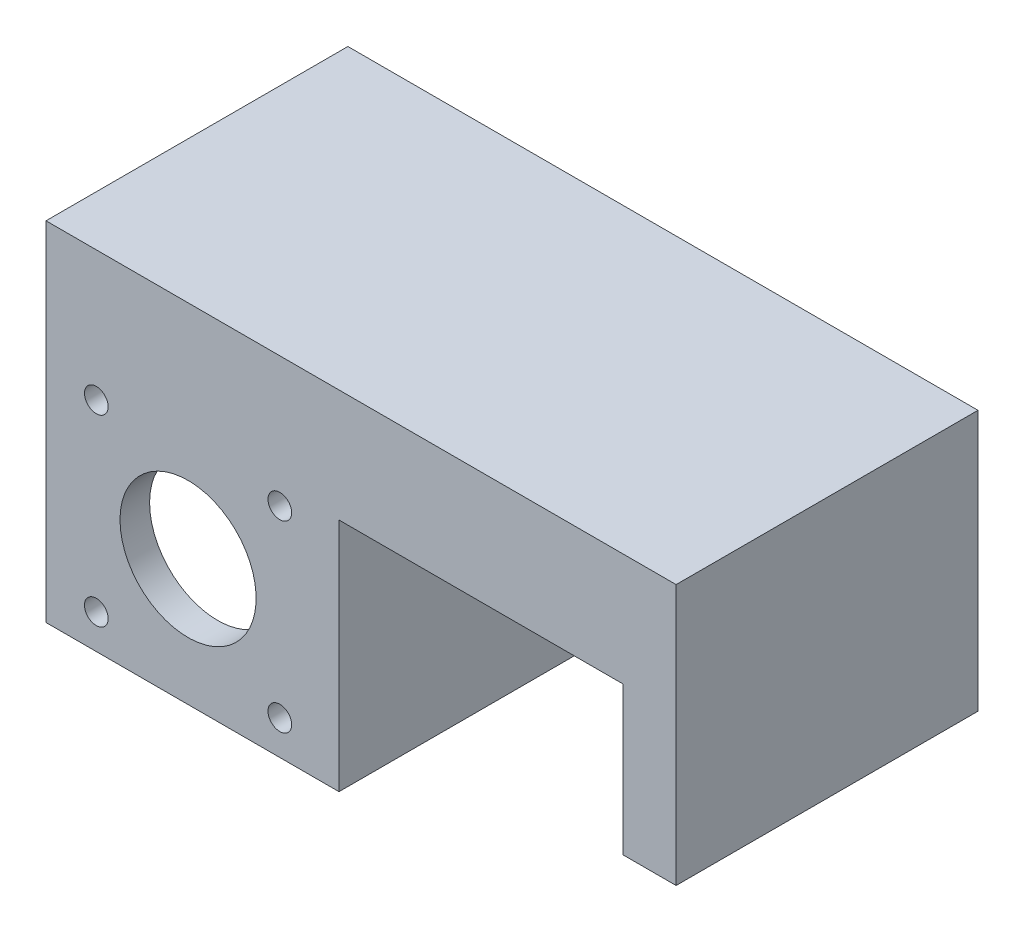
ISO-10303-21;
HEADER;
FILE_DESCRIPTION(('STEP AP214'),'2;1');
FILE_NAME('part.step','',(''),(''),'','','');
FILE_SCHEMA(('AUTOMOTIVE_DESIGN { 1 0 10303 214 1 1 1 1 }'));
ENDSEC;
DATA;
#1=APPLICATION_CONTEXT('core data for automotive mechanical design processes');
#2=APPLICATION_PROTOCOL_DEFINITION('international standard','automotive_design',2000,#1);
#3=PRODUCT_CONTEXT('',#1,'mechanical');
#4=PRODUCT('Part','Part','',(#3));
#5=PRODUCT_RELATED_PRODUCT_CATEGORY('part','',(#4));
#6=PRODUCT_DEFINITION_FORMATION('','',#4);
#7=PRODUCT_DEFINITION_CONTEXT('part definition',#1,'design');
#8=PRODUCT_DEFINITION('design','',#6,#7);
#9=PRODUCT_DEFINITION_SHAPE('','',#8);
#10=(LENGTH_UNIT() NAMED_UNIT(*) SI_UNIT(.MILLI.,.METRE.));
#11=(NAMED_UNIT(*) PLANE_ANGLE_UNIT() SI_UNIT($,.RADIAN.));
#12=(NAMED_UNIT(*) SI_UNIT($,.STERADIAN.) SOLID_ANGLE_UNIT());
#13=UNCERTAINTY_MEASURE_WITH_UNIT(LENGTH_MEASURE(1.E-05),#10,'distance_accuracy_value','');
#14=(GEOMETRIC_REPRESENTATION_CONTEXT(3) GLOBAL_UNCERTAINTY_ASSIGNED_CONTEXT((#13)) GLOBAL_UNIT_ASSIGNED_CONTEXT((#10,
#11,#12)) REPRESENTATION_CONTEXT('',''));
#15=CARTESIAN_POINT('',(0.,0.,0.));
#16=DIRECTION('',(0.,0.,1.));
#17=DIRECTION('',(1.,0.,0.));
#18=AXIS2_PLACEMENT_3D('',#15,#16,#17);
#19=CARTESIAN_POINT('',(49.5,-5.616325,-60.3469004731473));
#20=DIRECTION('',(-1.,0.,0.));
#21=DIRECTION('',(0.,-1.,0.));
#22=AXIS2_PLACEMENT_3D('',#19,#20,#21);
#23=PLANE('',#22);
#24=DIRECTION('',(0.,1.,0.));
#25=VECTOR('',#24,1.);
#26=CARTESIAN_POINT('',(49.5,-33.166325,-9.8082122));
#27=LINE('',#26,#25);
#28=CARTESIAN_POINT('',(49.5,-33.166325,-9.8082122));
#29=VERTEX_POINT('',#28);
#30=CARTESIAN_POINT('',(49.5,-8.166325,-9.8082122));
#31=VERTEX_POINT('',#30);
#32=EDGE_CURVE('E264',#29,#31,#27,.T.);
#33=ORIENTED_EDGE('',*,*,#32,.T.);
#34=DIRECTION('',(0.,0.,-1.));
#35=VECTOR('',#34,1.);
#36=CARTESIAN_POINT('',(49.5,-8.166325,-60.3469004731473));
#37=LINE('',#36,#35);
#38=CARTESIAN_POINT('',(49.5,-8.166325,33.1917878));
#39=VERTEX_POINT('',#38);
#40=EDGE_CURVE('E11',#39,#31,#37,.T.);
#41=ORIENTED_EDGE('',*,*,#40,.F.);
#42=DIRECTION('',(0.,-1.,0.));
#43=VECTOR('',#42,1.);
#44=CARTESIAN_POINT('',(49.5,-5.616325,33.1917878));
#45=LINE('',#44,#43);
#46=CARTESIAN_POINT('',(49.5,-47.916325,33.1917878));
#47=VERTEX_POINT('',#46);
#48=EDGE_CURVE('E250',#39,#47,#45,.T.);
#49=ORIENTED_EDGE('',*,*,#48,.T.);
#50=DIRECTION('',(0.,0.,1.));
#51=VECTOR('',#50,1.);
#52=CARTESIAN_POINT('',(49.5,-47.916325,-60.3469004731473));
#53=LINE('',#52,#51);
#54=CARTESIAN_POINT('',(49.5,-47.916325,-17.8082122));
#55=VERTEX_POINT('',#54);
#56=EDGE_CURVE('E146',#55,#47,#53,.T.);
#57=ORIENTED_EDGE('',*,*,#56,.F.);
#58=DIRECTION('',(0.,1.,0.));
#59=VECTOR('',#58,1.);
#60=CARTESIAN_POINT('',(49.5,-5.61632499999999,-17.8082122));
#61=LINE('',#60,#59);
#62=CARTESIAN_POINT('',(49.5,-33.166325,-17.8082122));
#63=VERTEX_POINT('',#62);
#64=EDGE_CURVE('E125',#55,#63,#61,.T.);
#65=ORIENTED_EDGE('',*,*,#64,.T.);
#66=DIRECTION('',(0.,0.,-1.));
#67=VECTOR('',#66,1.);
#68=CARTESIAN_POINT('',(49.5,-33.166325,-17.8082122));
#69=LINE('',#68,#67);
#70=EDGE_CURVE('E133',#29,#63,#69,.T.);
#71=ORIENTED_EDGE('',*,*,#70,.F.);
#72=EDGE_LOOP('',(#33,#41,#49,#57,#65,#71));
#73=FACE_BOUND('',#72,.T.);
#74=ADVANCED_FACE('F33',(#73),#23,.F.);
#75=CARTESIAN_POINT('',(0.,-8.166325,0.));
#76=DIRECTION('',(0.,1.,0.));
#77=DIRECTION('',(0.,0.,1.));
#78=AXIS2_PLACEMENT_3D('',#75,#76,#77);
#79=PLANE('',#78);
#80=DIRECTION('',(0.,0.,-1.));
#81=VECTOR('',#80,1.);
#82=CARTESIAN_POINT('',(97.45,-8.166325,-9.80821219999999));
#83=LINE('',#82,#81);
#84=CARTESIAN_POINT('',(97.45,-8.166325,33.1917878));
#85=VERTEX_POINT('',#84);
#86=CARTESIAN_POINT('',(97.45,-8.166325,-9.80821219999999));
#87=VERTEX_POINT('',#86);
#88=EDGE_CURVE('E262',#85,#87,#83,.T.);
#89=ORIENTED_EDGE('',*,*,#88,.F.);
#90=DIRECTION('',(-1.,0.,0.));
#91=VECTOR('',#90,1.);
#92=CARTESIAN_POINT('',(49.5,-8.166325,33.1917878));
#93=LINE('',#92,#91);
#94=EDGE_CURVE('E156',#85,#39,#93,.T.);
#95=ORIENTED_EDGE('',*,*,#94,.T.);
#96=ORIENTED_EDGE('',*,*,#40,.T.);
#97=DIRECTION('',(-1.,0.,0.));
#98=VECTOR('',#97,1.);
#99=CARTESIAN_POINT('',(49.5,-8.166325,-9.8082122));
#100=LINE('',#99,#98);
#101=EDGE_CURVE('E142',#87,#31,#100,.T.);
#102=ORIENTED_EDGE('',*,*,#101,.F.);
#103=EDGE_LOOP('',(#89,#95,#96,#102));
#104=FACE_BOUND('',#103,.T.);
#105=ADVANCED_FACE('F260',(#104),#79,.F.);
#106=CARTESIAN_POINT('',(48.,-5.616325,33.1917878));
#107=DIRECTION('',(0.,-1.,0.));
#108=DIRECTION('',(0.,0.,-1.));
#109=AXIS2_PLACEMENT_3D('',#106,#107,#108);
#110=PLANE('',#109);
#111=DIRECTION('',(1.,0.,0.));
#112=VECTOR('',#111,1.);
#113=CARTESIAN_POINT('',(-17.2191805697573,-5.616325,-17.8082122));
#114=LINE('',#113,#112);
#115=CARTESIAN_POINT('',(0.,-5.616325,-17.8082122));
#116=VERTEX_POINT('',#115);
#117=CARTESIAN_POINT('',(45.,-5.616325,-17.8082122));
#118=VERTEX_POINT('',#117);
#119=EDGE_CURVE('E152',#116,#118,#114,.T.);
#120=ORIENTED_EDGE('',*,*,#119,.T.);
#121=DIRECTION('',(0.,0.,1.));
#122=VECTOR('',#121,1.);
#123=CARTESIAN_POINT('',(45.,-5.616325,-60.3469004731473));
#124=LINE('',#123,#122);
#125=CARTESIAN_POINT('',(45.,-5.616325,28.1917878));
#126=VERTEX_POINT('',#125);
#127=EDGE_CURVE('E48',#118,#126,#124,.T.);
#128=ORIENTED_EDGE('',*,*,#127,.T.);
#129=DIRECTION('',(1.,0.,0.));
#130=VECTOR('',#129,1.);
#131=CARTESIAN_POINT('',(0.,-5.616325,28.1917878));
#132=LINE('',#131,#130);
#133=CARTESIAN_POINT('',(0.,-5.616325,28.1917878));
#134=VERTEX_POINT('',#133);
#135=EDGE_CURVE('E201',#134,#126,#132,.T.);
#136=ORIENTED_EDGE('',*,*,#135,.F.);
#137=DIRECTION('',(0.,0.,-1.));
#138=VECTOR('',#137,1.);
#139=CARTESIAN_POINT('',(0.,-5.616325,33.1917878));
#140=LINE('',#139,#138);
#141=EDGE_CURVE('E41',#134,#116,#140,.T.);
#142=ORIENTED_EDGE('',*,*,#141,.T.);
#143=EDGE_LOOP('',(#120,#128,#136,#142));
#144=FACE_BOUND('',#143,.T.);
#145=ADVANCED_FACE('F221',(#144),#110,.T.);
#146=CARTESIAN_POINT('',(0.,-47.916325,28.1917878));
#147=DIRECTION('',(0.,0.,1.));
#148=DIRECTION('',(1.,0.,0.));
#149=AXIS2_PLACEMENT_3D('',#146,#147,#148);
#150=PLANE('',#149);
#151=CARTESIAN_POINT('',(24.,-26.616325,28.1917878));
#152=DIRECTION('',(0.,0.,-1.));
#153=DIRECTION('',(-1.,0.,0.));
#154=AXIS2_PLACEMENT_3D('',#151,#152,#153);
#155=CIRCLE('',#154,11.5);
#156=CARTESIAN_POINT('',(12.5,-26.616325,28.1917878));
#157=VERTEX_POINT('',#156);
#158=EDGE_CURVE('E179',#157,#157,#155,.T.);
#159=ORIENTED_EDGE('',*,*,#158,.F.);
#160=EDGE_LOOP('',(#159));
#161=FACE_BOUND('',#160,.T.);
#162=CARTESIAN_POINT('',(39.5,-11.116325,28.1917878));
#163=DIRECTION('',(0.,0.,-1.));
#164=DIRECTION('',(-1.,0.,0.));
#165=AXIS2_PLACEMENT_3D('',#162,#163,#164);
#166=CIRCLE('',#165,2.);
#167=CARTESIAN_POINT('',(37.5,-11.116325,28.1917878));
#168=VERTEX_POINT('',#167);
#169=EDGE_CURVE('E172',#168,#168,#166,.T.);
#170=ORIENTED_EDGE('',*,*,#169,.F.);
#171=EDGE_LOOP('',(#170));
#172=FACE_BOUND('',#171,.T.);
#173=CARTESIAN_POINT('',(39.5,-42.116325,28.1917878));
#174=DIRECTION('',(0.,0.,-1.));
#175=DIRECTION('',(-1.,0.,0.));
#176=AXIS2_PLACEMENT_3D('',#173,#174,#175);
#177=CIRCLE('',#176,2.);
#178=CARTESIAN_POINT('',(37.5,-42.116325,28.1917878));
#179=VERTEX_POINT('',#178);
#180=EDGE_CURVE('E180',#179,#179,#177,.T.);
#181=ORIENTED_EDGE('',*,*,#180,.F.);
#182=EDGE_LOOP('',(#181));
#183=FACE_BOUND('',#182,.T.);
#184=CARTESIAN_POINT('',(8.5,-11.116325,28.1917878));
#185=DIRECTION('',(0.,0.,-1.));
#186=DIRECTION('',(-1.,0.,0.));
#187=AXIS2_PLACEMENT_3D('',#184,#185,#186);
#188=CIRCLE('',#187,2.);
#189=CARTESIAN_POINT('',(6.5,-11.116325,28.1917878));
#190=VERTEX_POINT('',#189);
#191=EDGE_CURVE('E186',#190,#190,#188,.T.);
#192=ORIENTED_EDGE('',*,*,#191,.F.);
#193=EDGE_LOOP('',(#192));
#194=FACE_BOUND('',#193,.T.);
#195=CARTESIAN_POINT('',(8.5,-42.116325,28.1917878));
#196=DIRECTION('',(0.,0.,-1.));
#197=DIRECTION('',(-1.,0.,0.));
#198=AXIS2_PLACEMENT_3D('',#195,#196,#197);
#199=CIRCLE('',#198,2.);
#200=CARTESIAN_POINT('',(6.5,-42.116325,28.1917878));
#201=VERTEX_POINT('',#200);
#202=EDGE_CURVE('E168',#201,#201,#199,.T.);
#203=ORIENTED_EDGE('',*,*,#202,.F.);
#204=EDGE_LOOP('',(#203));
#205=FACE_BOUND('',#204,.T.);
#206=DIRECTION('',(0.,1.,0.));
#207=VECTOR('',#206,1.);
#208=CARTESIAN_POINT('',(45.,-5.616325,28.1917878));
#209=LINE('',#208,#207);
#210=CARTESIAN_POINT('',(45.,-47.916325,28.1917878));
#211=VERTEX_POINT('',#210);
#212=EDGE_CURVE('E55',#211,#126,#209,.T.);
#213=ORIENTED_EDGE('',*,*,#212,.F.);
#214=DIRECTION('',(1.,0.,0.));
#215=VECTOR('',#214,1.);
#216=CARTESIAN_POINT('',(0.,-47.916325,28.1917878));
#217=LINE('',#216,#215);
#218=CARTESIAN_POINT('',(0.,-47.916325,28.1917878));
#219=VERTEX_POINT('',#218);
#220=EDGE_CURVE('E205',#219,#211,#217,.T.);
#221=ORIENTED_EDGE('',*,*,#220,.F.);
#222=DIRECTION('',(0.,1.,0.));
#223=VECTOR('',#222,1.);
#224=CARTESIAN_POINT('',(0.,-47.916325,28.1917878));
#225=LINE('',#224,#223);
#226=EDGE_CURVE('E210',#219,#134,#225,.T.);
#227=ORIENTED_EDGE('',*,*,#226,.T.);
#228=ORIENTED_EDGE('',*,*,#135,.T.);
#229=EDGE_LOOP('',(#213,#221,#227,#228));
#230=FACE_BOUND('',#229,.T.);
#231=ADVANCED_FACE('F234',(#161,#172,#183,#194,#205,#230),#150,.F.);
#232=CARTESIAN_POINT('',(0.,0.,10.));
#233=DIRECTION('',(1.,0.,0.));
#234=DIRECTION('',(0.,0.,-1.));
#235=AXIS2_PLACEMENT_3D('',#232,#233,#234);
#236=PLANE('',#235);
#237=DIRECTION('',(0.,0.,-1.));
#238=VECTOR('',#237,1.);
#239=CARTESIAN_POINT('',(0.,10.8609375,82.405200233796));
#240=LINE('',#239,#238);
#241=CARTESIAN_POINT('',(0.,10.8609375,33.1917878));
#242=VERTEX_POINT('',#241);
#243=CARTESIAN_POINT('',(0.,10.8609375,-17.8082122));
#244=VERTEX_POINT('',#243);
#245=EDGE_CURVE('E214',#242,#244,#240,.T.);
#246=ORIENTED_EDGE('',*,*,#245,.T.);
#247=DIRECTION('',(0.,1.,0.));
#248=VECTOR('',#247,1.);
#249=CARTESIAN_POINT('',(0.,10.8609375,-17.8082122));
#250=LINE('',#249,#248);
#251=EDGE_CURVE('E165',#116,#244,#250,.T.);
#252=ORIENTED_EDGE('',*,*,#251,.F.);
#253=ORIENTED_EDGE('',*,*,#141,.F.);
#254=ORIENTED_EDGE('',*,*,#226,.F.);
#255=DIRECTION('',(0.,0.,-1.));
#256=VECTOR('',#255,1.);
#257=CARTESIAN_POINT('',(0.,-47.916325,28.1917878));
#258=LINE('',#257,#256);
#259=CARTESIAN_POINT('',(0.,-47.916325,33.1917878));
#260=VERTEX_POINT('',#259);
#261=EDGE_CURVE('E202',#260,#219,#258,.T.);
#262=ORIENTED_EDGE('',*,*,#261,.F.);
#263=DIRECTION('',(0.,1.,0.));
#264=VECTOR('',#263,1.);
#265=CARTESIAN_POINT('',(0.,0.,33.1917878));
#266=LINE('',#265,#264);
#267=EDGE_CURVE('E218',#260,#242,#266,.T.);
#268=ORIENTED_EDGE('',*,*,#267,.T.);
#269=EDGE_LOOP('',(#246,#252,#253,#254,#262,#268));
#270=FACE_BOUND('',#269,.T.);
#271=ADVANCED_FACE('F35',(#270),#236,.F.);
#272=CARTESIAN_POINT('',(0.,0.,33.1917878));
#273=DIRECTION('',(0.,0.,-1.));
#274=DIRECTION('',(-1.,0.,0.));
#275=AXIS2_PLACEMENT_3D('',#272,#273,#274);
#276=PLANE('',#275);
#277=DIRECTION('',(-1.,0.,0.));
#278=VECTOR('',#277,1.);
#279=CARTESIAN_POINT('',(0.,-47.916325,33.1917878));
#280=LINE('',#279,#278);
#281=EDGE_CURVE('E207',#47,#260,#280,.T.);
#282=ORIENTED_EDGE('',*,*,#281,.F.);
#283=ORIENTED_EDGE('',*,*,#48,.F.);
#284=ORIENTED_EDGE('',*,*,#94,.F.);
#285=DIRECTION('',(0.,1.,0.));
#286=VECTOR('',#285,1.);
#287=CARTESIAN_POINT('',(97.45,-33.166325,33.1917878));
#288=LINE('',#287,#286);
#289=CARTESIAN_POINT('',(97.45,-33.166325,33.1917878));
#290=VERTEX_POINT('',#289);
#291=EDGE_CURVE('E252',#290,#85,#288,.T.);
#292=ORIENTED_EDGE('',*,*,#291,.F.);
#293=DIRECTION('',(-1.,0.,0.));
#294=VECTOR('',#293,1.);
#295=CARTESIAN_POINT('',(106.45,-33.166325,33.1917878));
#296=LINE('',#295,#294);
#297=CARTESIAN_POINT('',(106.45,-33.166325,33.1917878));
#298=VERTEX_POINT('',#297);
#299=EDGE_CURVE('E278',#298,#290,#296,.T.);
#300=ORIENTED_EDGE('',*,*,#299,.F.);
#301=DIRECTION('',(0.,-1.,0.));
#302=VECTOR('',#301,1.);
#303=CARTESIAN_POINT('',(106.45,-8.166325,33.1917878));
#304=LINE('',#303,#302);
#305=CARTESIAN_POINT('',(106.45,10.8609375,33.1917878));
#306=VERTEX_POINT('',#305);
#307=EDGE_CURVE('E241',#306,#298,#304,.T.);
#308=ORIENTED_EDGE('',*,*,#307,.F.);
#309=DIRECTION('',(1.,0.,0.));
#310=VECTOR('',#309,1.);
#311=CARTESIAN_POINT('',(0.,10.8609375,33.1917878));
#312=LINE('',#311,#310);
#313=EDGE_CURVE('E216',#242,#306,#312,.T.);
#314=ORIENTED_EDGE('',*,*,#313,.F.);
#315=ORIENTED_EDGE('',*,*,#267,.F.);
#316=EDGE_LOOP('',(#282,#283,#284,#292,#300,#308,#314,#315));
#317=FACE_BOUND('',#316,.T.);
#318=CARTESIAN_POINT('',(8.5,-42.116325,33.1917878));
#319=DIRECTION('',(0.,0.,-1.));
#320=DIRECTION('',(-1.,0.,0.));
#321=AXIS2_PLACEMENT_3D('',#318,#319,#320);
#322=CIRCLE('',#321,2.);
#323=CARTESIAN_POINT('',(6.5,-42.116325,33.1917878));
#324=VERTEX_POINT('',#323);
#325=EDGE_CURVE('E189',#324,#324,#322,.F.);
#326=ORIENTED_EDGE('',*,*,#325,.F.);
#327=EDGE_LOOP('',(#326));
#328=FACE_BOUND('',#327,.T.);
#329=CARTESIAN_POINT('',(8.5,-11.116325,33.1917878));
#330=DIRECTION('',(0.,0.,-1.));
#331=DIRECTION('',(-1.,0.,0.));
#332=AXIS2_PLACEMENT_3D('',#329,#330,#331);
#333=CIRCLE('',#332,2.);
#334=CARTESIAN_POINT('',(6.5,-11.116325,33.1917878));
#335=VERTEX_POINT('',#334);
#336=EDGE_CURVE('E183',#335,#335,#333,.F.);
#337=ORIENTED_EDGE('',*,*,#336,.F.);
#338=EDGE_LOOP('',(#337));
#339=FACE_BOUND('',#338,.T.);
#340=CARTESIAN_POINT('',(39.5,-42.116325,33.1917878));
#341=DIRECTION('',(0.,0.,-1.));
#342=DIRECTION('',(-1.,0.,0.));
#343=AXIS2_PLACEMENT_3D('',#340,#341,#342);
#344=CIRCLE('',#343,2.);
#345=CARTESIAN_POINT('',(37.5,-42.116325,33.1917878));
#346=VERTEX_POINT('',#345);
#347=EDGE_CURVE('E176',#346,#346,#344,.F.);
#348=ORIENTED_EDGE('',*,*,#347,.F.);
#349=EDGE_LOOP('',(#348));
#350=FACE_BOUND('',#349,.T.);
#351=CARTESIAN_POINT('',(39.5,-11.116325,33.1917878));
#352=DIRECTION('',(0.,0.,-1.));
#353=DIRECTION('',(-1.,0.,0.));
#354=AXIS2_PLACEMENT_3D('',#351,#352,#353);
#355=CIRCLE('',#354,2.);
#356=CARTESIAN_POINT('',(37.5,-11.116325,33.1917878));
#357=VERTEX_POINT('',#356);
#358=EDGE_CURVE('E175',#357,#357,#355,.F.);
#359=ORIENTED_EDGE('',*,*,#358,.F.);
#360=EDGE_LOOP('',(#359));
#361=FACE_BOUND('',#360,.T.);
#362=CARTESIAN_POINT('',(24.,-26.616325,33.1917878));
#363=DIRECTION('',(0.,0.,-1.));
#364=DIRECTION('',(-1.,0.,0.));
#365=AXIS2_PLACEMENT_3D('',#362,#363,#364);
#366=CIRCLE('',#365,11.5);
#367=CARTESIAN_POINT('',(12.5,-26.616325,33.1917878));
#368=VERTEX_POINT('',#367);
#369=EDGE_CURVE('E198',#368,#368,#366,.F.);
#370=ORIENTED_EDGE('',*,*,#369,.F.);
#371=EDGE_LOOP('',(#370));
#372=FACE_BOUND('',#371,.T.);
#373=ADVANCED_FACE('F238',(#317,#328,#339,#350,#361,#372),#276,.F.);
#374=CARTESIAN_POINT('',(0.,10.8609375,82.405200233796));
#375=DIRECTION('',(0.,-1.,0.));
#376=DIRECTION('',(0.,0.,-1.));
#377=AXIS2_PLACEMENT_3D('',#374,#375,#376);
#378=PLANE('',#377);
#379=ORIENTED_EDGE('',*,*,#245,.F.);
#380=ORIENTED_EDGE('',*,*,#313,.T.);
#381=DIRECTION('',(0.,0.,1.));
#382=VECTOR('',#381,1.);
#383=CARTESIAN_POINT('',(106.45,10.8609375,33.1917878));
#384=LINE('',#383,#382);
#385=CARTESIAN_POINT('',(106.45,10.8609375,-17.8082122));
#386=VERTEX_POINT('',#385);
#387=EDGE_CURVE('E246',#386,#306,#384,.T.);
#388=ORIENTED_EDGE('',*,*,#387,.F.);
#389=DIRECTION('',(1.,0.,0.));
#390=VECTOR('',#389,1.);
#391=CARTESIAN_POINT('',(-17.2191805697573,10.8609375,-17.8082122));
#392=LINE('',#391,#390);
#393=EDGE_CURVE('E169',#244,#386,#392,.T.);
#394=ORIENTED_EDGE('',*,*,#393,.F.);
#395=EDGE_LOOP('',(#379,#380,#388,#394));
#396=FACE_BOUND('',#395,.T.);
#397=ADVANCED_FACE('F245',(#396),#378,.F.);
#398=CARTESIAN_POINT('',(0.,-47.916325,0.));
#399=DIRECTION('',(0.,1.,0.));
#400=DIRECTION('',(0.,0.,1.));
#401=AXIS2_PLACEMENT_3D('',#398,#399,#400);
#402=PLANE('',#401);
#403=ORIENTED_EDGE('',*,*,#56,.T.);
#404=ORIENTED_EDGE('',*,*,#281,.T.);
#405=ORIENTED_EDGE('',*,*,#261,.T.);
#406=ORIENTED_EDGE('',*,*,#220,.T.);
#407=DIRECTION('',(0.,0.,1.));
#408=VECTOR('',#407,1.);
#409=CARTESIAN_POINT('',(45.,-47.916325,-60.3469004731473));
#410=LINE('',#409,#408);
#411=CARTESIAN_POINT('',(45.,-47.916325,-17.8082122));
#412=VERTEX_POINT('',#411);
#413=EDGE_CURVE('E160',#412,#211,#410,.T.);
#414=ORIENTED_EDGE('',*,*,#413,.F.);
#415=DIRECTION('',(1.,0.,0.));
#416=VECTOR('',#415,1.);
#417=CARTESIAN_POINT('',(48.,-47.916325,-17.8082122));
#418=LINE('',#417,#416);
#419=EDGE_CURVE('E149',#412,#55,#418,.T.);
#420=ORIENTED_EDGE('',*,*,#419,.T.);
#421=EDGE_LOOP('',(#403,#404,#405,#406,#414,#420));
#422=FACE_BOUND('',#421,.T.);
#423=ADVANCED_FACE('F232',(#422),#402,.F.);
#424=CARTESIAN_POINT('',(24.,-26.616325,50.001));
#425=DIRECTION('',(0.,0.,-1.));
#426=DIRECTION('',(-1.,0.,0.));
#427=AXIS2_PLACEMENT_3D('',#424,#425,#426);
#428=CYLINDRICAL_SURFACE('',#427,11.5);
#429=ORIENTED_EDGE('',*,*,#158,.T.);
#430=EDGE_LOOP('',(#429));
#431=FACE_BOUND('',#430,.T.);
#432=ORIENTED_EDGE('',*,*,#369,.T.);
#433=EDGE_LOOP('',(#432));
#434=FACE_BOUND('',#433,.T.);
#435=ADVANCED_FACE('F330',(#431,#434),#428,.F.);
#436=CARTESIAN_POINT('',(39.5,-11.116325,50.001));
#437=DIRECTION('',(0.,0.,-1.));
#438=DIRECTION('',(-1.,0.,0.));
#439=AXIS2_PLACEMENT_3D('',#436,#437,#438);
#440=CYLINDRICAL_SURFACE('',#439,2.);
#441=ORIENTED_EDGE('',*,*,#169,.T.);
#442=EDGE_LOOP('',(#441));
#443=FACE_BOUND('',#442,.T.);
#444=ORIENTED_EDGE('',*,*,#358,.T.);
#445=EDGE_LOOP('',(#444));
#446=FACE_BOUND('',#445,.T.);
#447=ADVANCED_FACE('F326',(#443,#446),#440,.F.);
#448=CARTESIAN_POINT('',(39.5,-42.116325,50.001));
#449=DIRECTION('',(0.,0.,-1.));
#450=DIRECTION('',(-1.,0.,0.));
#451=AXIS2_PLACEMENT_3D('',#448,#449,#450);
#452=CYLINDRICAL_SURFACE('',#451,2.);
#453=ORIENTED_EDGE('',*,*,#180,.T.);
#454=EDGE_LOOP('',(#453));
#455=FACE_BOUND('',#454,.T.);
#456=ORIENTED_EDGE('',*,*,#347,.T.);
#457=EDGE_LOOP('',(#456));
#458=FACE_BOUND('',#457,.T.);
#459=ADVANCED_FACE('F329',(#455,#458),#452,.F.);
#460=CARTESIAN_POINT('',(8.5,-11.116325,50.001));
#461=DIRECTION('',(0.,0.,-1.));
#462=DIRECTION('',(-1.,0.,0.));
#463=AXIS2_PLACEMENT_3D('',#460,#461,#462);
#464=CYLINDRICAL_SURFACE('',#463,2.);
#465=ORIENTED_EDGE('',*,*,#191,.T.);
#466=EDGE_LOOP('',(#465));
#467=FACE_BOUND('',#466,.T.);
#468=ORIENTED_EDGE('',*,*,#336,.T.);
#469=EDGE_LOOP('',(#468));
#470=FACE_BOUND('',#469,.T.);
#471=ADVANCED_FACE('F334',(#467,#470),#464,.F.);
#472=CARTESIAN_POINT('',(8.5,-42.116325,50.001));
#473=DIRECTION('',(0.,0.,-1.));
#474=DIRECTION('',(-1.,0.,0.));
#475=AXIS2_PLACEMENT_3D('',#472,#473,#474);
#476=CYLINDRICAL_SURFACE('',#475,2.);
#477=ORIENTED_EDGE('',*,*,#202,.T.);
#478=EDGE_LOOP('',(#477));
#479=FACE_BOUND('',#478,.T.);
#480=ORIENTED_EDGE('',*,*,#325,.T.);
#481=EDGE_LOOP('',(#480));
#482=FACE_BOUND('',#481,.T.);
#483=ADVANCED_FACE('F325',(#479,#482),#476,.F.);
#484=CARTESIAN_POINT('',(-17.2191805697573,10.8609375,-17.8082122));
#485=DIRECTION('',(0.,0.,1.));
#486=DIRECTION('',(0.,-1.,0.));
#487=AXIS2_PLACEMENT_3D('',#484,#485,#486);
#488=PLANE('',#487);
#489=CARTESIAN_POINT('',(58.475,-26.166325,-17.8082122));
#490=DIRECTION('',(0.,0.,1.));
#491=DIRECTION('',(1.,0.,0.));
#492=AXIS2_PLACEMENT_3D('',#489,#490,#491);
#493=CIRCLE('',#492,1.9304);
#494=CARTESIAN_POINT('',(60.4054,-26.166325,-17.8082122));
#495=VERTEX_POINT('',#494);
#496=EDGE_CURVE('E282',#495,#495,#493,.T.);
#497=ORIENTED_EDGE('',*,*,#496,.T.);
#498=EDGE_LOOP('',(#497));
#499=FACE_BOUND('',#498,.T.);
#500=CARTESIAN_POINT('',(88.475,-26.166325,-17.8082122));
#501=DIRECTION('',(0.,0.,1.));
#502=DIRECTION('',(1.,0.,0.));
#503=AXIS2_PLACEMENT_3D('',#500,#501,#502);
#504=CIRCLE('',#503,1.9304);
#505=CARTESIAN_POINT('',(90.4054,-26.166325,-17.8082122));
#506=VERTEX_POINT('',#505);
#507=EDGE_CURVE('E289',#506,#506,#504,.T.);
#508=ORIENTED_EDGE('',*,*,#507,.T.);
#509=EDGE_LOOP('',(#508));
#510=FACE_BOUND('',#509,.T.);
#511=ORIENTED_EDGE('',*,*,#393,.T.);
#512=DIRECTION('',(0.,1.,0.));
#513=VECTOR('',#512,1.);
#514=CARTESIAN_POINT('',(106.45,-8.166325,-17.8082122));
#515=LINE('',#514,#513);
#516=CARTESIAN_POINT('',(106.45,-33.166325,-17.8082122));
#517=VERTEX_POINT('',#516);
#518=EDGE_CURVE('E128',#517,#386,#515,.T.);
#519=ORIENTED_EDGE('',*,*,#518,.F.);
#520=DIRECTION('',(1.,0.,0.));
#521=VECTOR('',#520,1.);
#522=CARTESIAN_POINT('',(49.5,-33.166325,-17.8082122));
#523=LINE('',#522,#521);
#524=EDGE_CURVE('E121',#63,#517,#523,.T.);
#525=ORIENTED_EDGE('',*,*,#524,.F.);
#526=ORIENTED_EDGE('',*,*,#64,.F.);
#527=ORIENTED_EDGE('',*,*,#419,.F.);
#528=DIRECTION('',(0.,-1.,0.));
#529=VECTOR('',#528,1.);
#530=CARTESIAN_POINT('',(45.,-5.61632499999999,-17.8082122));
#531=LINE('',#530,#529);
#532=EDGE_CURVE('E148',#118,#412,#531,.T.);
#533=ORIENTED_EDGE('',*,*,#532,.F.);
#534=ORIENTED_EDGE('',*,*,#119,.F.);
#535=ORIENTED_EDGE('',*,*,#251,.T.);
#536=EDGE_LOOP('',(#511,#519,#525,#526,#527,#533,#534,#535));
#537=FACE_BOUND('',#536,.T.);
#538=ADVANCED_FACE('F123',(#499,#510,#537),#488,.F.);
#539=CARTESIAN_POINT('',(45.,-5.616325,-60.3469004731473));
#540=DIRECTION('',(1.,0.,0.));
#541=DIRECTION('',(0.,1.,0.));
#542=AXIS2_PLACEMENT_3D('',#539,#540,#541);
#543=PLANE('',#542);
#544=ORIENTED_EDGE('',*,*,#127,.F.);
#545=ORIENTED_EDGE('',*,*,#532,.T.);
#546=ORIENTED_EDGE('',*,*,#413,.T.);
#547=ORIENTED_EDGE('',*,*,#212,.T.);
#548=EDGE_LOOP('',(#544,#545,#546,#547));
#549=FACE_BOUND('',#548,.T.);
#550=ADVANCED_FACE('F230',(#549),#543,.F.);
#551=CARTESIAN_POINT('',(106.45,0.,0.));
#552=DIRECTION('',(-1.,0.,0.));
#553=DIRECTION('',(0.,0.,1.));
#554=AXIS2_PLACEMENT_3D('',#551,#552,#553);
#555=PLANE('',#554);
#556=ORIENTED_EDGE('',*,*,#307,.T.);
#557=DIRECTION('',(0.,0.,1.));
#558=VECTOR('',#557,1.);
#559=CARTESIAN_POINT('',(106.45,-33.166325,-17.8082122));
#560=LINE('',#559,#558);
#561=EDGE_CURVE('E132',#517,#298,#560,.T.);
#562=ORIENTED_EDGE('',*,*,#561,.F.);
#563=ORIENTED_EDGE('',*,*,#518,.T.);
#564=ORIENTED_EDGE('',*,*,#387,.T.);
#565=EDGE_LOOP('',(#556,#562,#563,#564));
#566=FACE_BOUND('',#565,.T.);
#567=ADVANCED_FACE('F248',(#566),#555,.F.);
#568=CARTESIAN_POINT('',(97.45,-33.166325,-9.80821219999999));
#569=DIRECTION('',(1.,0.,0.));
#570=DIRECTION('',(0.,0.,-1.));
#571=AXIS2_PLACEMENT_3D('',#568,#569,#570);
#572=PLANE('',#571);
#573=ORIENTED_EDGE('',*,*,#88,.T.);
#574=DIRECTION('',(0.,1.,0.));
#575=VECTOR('',#574,1.);
#576=CARTESIAN_POINT('',(97.45,-33.166325,-9.80821219999999));
#577=LINE('',#576,#575);
#578=CARTESIAN_POINT('',(97.45,-33.166325,-9.80821219999999));
#579=VERTEX_POINT('',#578);
#580=EDGE_CURVE('E266',#579,#87,#577,.T.);
#581=ORIENTED_EDGE('',*,*,#580,.F.);
#582=DIRECTION('',(0.,0.,-1.));
#583=VECTOR('',#582,1.);
#584=CARTESIAN_POINT('',(97.45,-33.166325,-9.80821219999999));
#585=LINE('',#584,#583);
#586=EDGE_CURVE('E270',#290,#579,#585,.T.);
#587=ORIENTED_EDGE('',*,*,#586,.F.);
#588=ORIENTED_EDGE('',*,*,#291,.T.);
#589=EDGE_LOOP('',(#573,#581,#587,#588));
#590=FACE_BOUND('',#589,.T.);
#591=ADVANCED_FACE('F276',(#590),#572,.F.);
#592=CARTESIAN_POINT('',(49.5,-33.166325,-9.8082122));
#593=DIRECTION('',(0.,0.,-1.));
#594=DIRECTION('',(-1.,0.,0.));
#595=AXIS2_PLACEMENT_3D('',#592,#593,#594);
#596=PLANE('',#595);
#597=CARTESIAN_POINT('',(58.475,-26.166325,-9.80821220000001));
#598=DIRECTION('',(0.,0.,1.));
#599=DIRECTION('',(1.,0.,0.));
#600=AXIS2_PLACEMENT_3D('',#597,#598,#599);
#601=CIRCLE('',#600,1.9304);
#602=CARTESIAN_POINT('',(60.4054,-26.166325,-9.80821220000001));
#603=VERTEX_POINT('',#602);
#604=EDGE_CURVE('E284',#603,#603,#601,.T.);
#605=ORIENTED_EDGE('',*,*,#604,.F.);
#606=EDGE_LOOP('',(#605));
#607=FACE_BOUND('',#606,.T.);
#608=CARTESIAN_POINT('',(88.475,-26.166325,-9.80821220000001));
#609=DIRECTION('',(0.,0.,1.));
#610=DIRECTION('',(1.,0.,0.));
#611=AXIS2_PLACEMENT_3D('',#608,#609,#610);
#612=CIRCLE('',#611,1.9304);
#613=CARTESIAN_POINT('',(90.4054,-26.166325,-9.80821220000001));
#614=VERTEX_POINT('',#613);
#615=EDGE_CURVE('E294',#614,#614,#612,.T.);
#616=ORIENTED_EDGE('',*,*,#615,.F.);
#617=EDGE_LOOP('',(#616));
#618=FACE_BOUND('',#617,.T.);
#619=ORIENTED_EDGE('',*,*,#101,.T.);
#620=ORIENTED_EDGE('',*,*,#32,.F.);
#621=DIRECTION('',(-1.,0.,0.));
#622=VECTOR('',#621,1.);
#623=CARTESIAN_POINT('',(49.5,-33.166325,-9.8082122));
#624=LINE('',#623,#622);
#625=EDGE_CURVE('E138',#579,#29,#624,.T.);
#626=ORIENTED_EDGE('',*,*,#625,.F.);
#627=ORIENTED_EDGE('',*,*,#580,.T.);
#628=EDGE_LOOP('',(#619,#620,#626,#627));
#629=FACE_BOUND('',#628,.T.);
#630=ADVANCED_FACE('F300',(#607,#618,#629),#596,.F.);
#631=CARTESIAN_POINT('',(0.,-33.166325,0.));
#632=DIRECTION('',(0.,1.,0.));
#633=DIRECTION('',(0.,0.,1.));
#634=AXIS2_PLACEMENT_3D('',#631,#632,#633);
#635=PLANE('',#634);
#636=ORIENTED_EDGE('',*,*,#70,.T.);
#637=ORIENTED_EDGE('',*,*,#524,.T.);
#638=ORIENTED_EDGE('',*,*,#561,.T.);
#639=ORIENTED_EDGE('',*,*,#299,.T.);
#640=ORIENTED_EDGE('',*,*,#586,.T.);
#641=ORIENTED_EDGE('',*,*,#625,.T.);
#642=EDGE_LOOP('',(#636,#637,#638,#639,#640,#641));
#643=FACE_BOUND('',#642,.T.);
#644=ADVANCED_FACE('F136',(#643),#635,.F.);
#645=CARTESIAN_POINT('',(88.475,-26.166325,-17.8082122));
#646=DIRECTION('',(0.,0.,1.));
#647=DIRECTION('',(1.,0.,0.));
#648=AXIS2_PLACEMENT_3D('',#645,#646,#647);
#649=CYLINDRICAL_SURFACE('',#648,1.9304);
#650=ORIENTED_EDGE('',*,*,#507,.F.);
#651=EDGE_LOOP('',(#650));
#652=FACE_BOUND('',#651,.T.);
#653=ORIENTED_EDGE('',*,*,#615,.T.);
#654=EDGE_LOOP('',(#653));
#655=FACE_BOUND('',#654,.T.);
#656=ADVANCED_FACE('F298',(#652,#655),#649,.F.);
#657=CARTESIAN_POINT('',(58.475,-26.166325,-17.8082122));
#658=DIRECTION('',(0.,0.,1.));
#659=DIRECTION('',(1.,0.,0.));
#660=AXIS2_PLACEMENT_3D('',#657,#658,#659);
#661=CYLINDRICAL_SURFACE('',#660,1.9304);
#662=ORIENTED_EDGE('',*,*,#496,.F.);
#663=EDGE_LOOP('',(#662));
#664=FACE_BOUND('',#663,.T.);
#665=ORIENTED_EDGE('',*,*,#604,.T.);
#666=EDGE_LOOP('',(#665));
#667=FACE_BOUND('',#666,.T.);
#668=ADVANCED_FACE('F466',(#664,#667),#661,.F.);
#669=CLOSED_SHELL('',(#74,#105,#145,#231,#271,#373,#397,#423,#435,#447,#459,#471,#483,#538,#550,
#567,#591,#630,#644,#656,#668));
#670=MANIFOLD_SOLID_BREP('B2',#669);
#671=ADVANCED_BREP_SHAPE_REPRESENTATION('',(#18,#670),#14);
#672=SHAPE_DEFINITION_REPRESENTATION(#9,#671);
ENDSEC;
END-ISO-10303-21;
